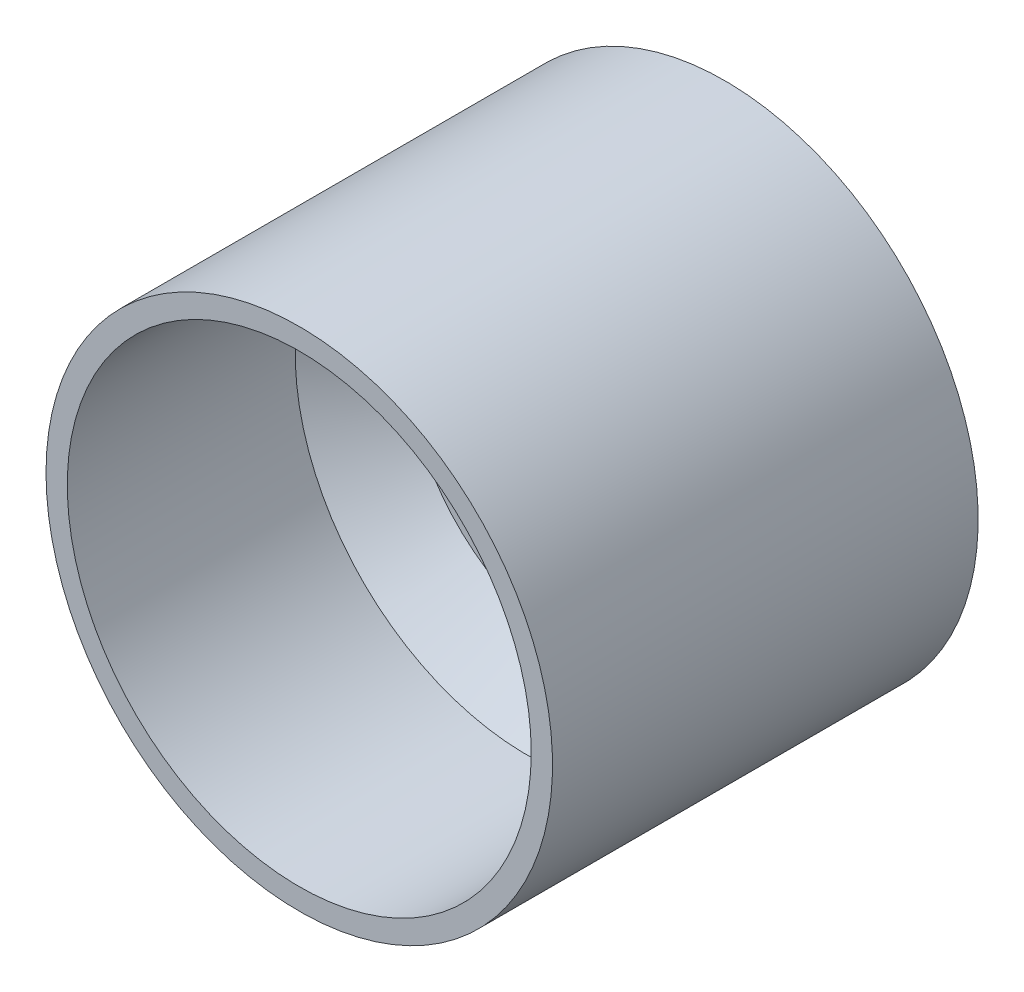
ISO-10303-21;
HEADER;
FILE_DESCRIPTION(('STEP AP214'),'2;1');
FILE_NAME('part.step','',(''),(''),'','','');
FILE_SCHEMA(('AUTOMOTIVE_DESIGN { 1 0 10303 214 1 1 1 1 }'));
ENDSEC;
DATA;
#1=APPLICATION_CONTEXT('core data for automotive mechanical design processes');
#2=APPLICATION_PROTOCOL_DEFINITION('international standard','automotive_design',2000,#1);
#3=PRODUCT_CONTEXT('',#1,'mechanical');
#4=PRODUCT('Part','Part','',(#3));
#5=PRODUCT_RELATED_PRODUCT_CATEGORY('part','',(#4));
#6=PRODUCT_DEFINITION_FORMATION('','',#4);
#7=PRODUCT_DEFINITION_CONTEXT('part definition',#1,'design');
#8=PRODUCT_DEFINITION('design','',#6,#7);
#9=PRODUCT_DEFINITION_SHAPE('','',#8);
#10=(LENGTH_UNIT() NAMED_UNIT(*) SI_UNIT(.MILLI.,.METRE.));
#11=(NAMED_UNIT(*) PLANE_ANGLE_UNIT() SI_UNIT($,.RADIAN.));
#12=(NAMED_UNIT(*) SI_UNIT($,.STERADIAN.) SOLID_ANGLE_UNIT());
#13=UNCERTAINTY_MEASURE_WITH_UNIT(LENGTH_MEASURE(1.E-05),#10,'distance_accuracy_value','');
#14=(GEOMETRIC_REPRESENTATION_CONTEXT(3) GLOBAL_UNCERTAINTY_ASSIGNED_CONTEXT((#13)) GLOBAL_UNIT_ASSIGNED_CONTEXT((#10,
#11,#12)) REPRESENTATION_CONTEXT('',''));
#15=CARTESIAN_POINT('',(0.,0.,0.));
#16=DIRECTION('',(0.,0.,1.));
#17=DIRECTION('',(1.,0.,0.));
#18=AXIS2_PLACEMENT_3D('',#15,#16,#17);
#19=CARTESIAN_POINT('',(0.,0.,38.1));
#20=DIRECTION('',(0.,0.,-1.));
#21=DIRECTION('',(-1.,0.,0.));
#22=AXIS2_PLACEMENT_3D('',#19,#20,#21);
#23=CYLINDRICAL_SURFACE('',#22,45.339);
#24=CARTESIAN_POINT('',(0.,0.,38.1));
#25=DIRECTION('',(0.,0.,1.));
#26=DIRECTION('',(1.,0.,0.));
#27=AXIS2_PLACEMENT_3D('',#24,#25,#26);
#28=CIRCLE('',#27,45.339);
#29=CARTESIAN_POINT('',(-45.339,0.,38.1));
#30=VERTEX_POINT('',#29);
#31=EDGE_CURVE('E60',#30,#30,#28,.T.);
#32=CARTESIAN_POINT('',(0.,0.,-38.1));
#33=DIRECTION('',(0.,0.,1.));
#34=DIRECTION('',(1.,0.,0.));
#35=AXIS2_PLACEMENT_3D('',#32,#33,#34);
#36=CIRCLE('',#35,45.339);
#37=CARTESIAN_POINT('',(-45.339,0.,-38.1));
#38=VERTEX_POINT('',#37);
#39=EDGE_CURVE('E61',#38,#38,#36,.T.);
#40=CARTESIAN_POINT('',(-45.339,0.,38.1));
#41=CARTESIAN_POINT('',(-45.339,0.,37.30625));
#42=CARTESIAN_POINT('',(-45.339,0.,36.5125));
#43=CARTESIAN_POINT('',(-45.339,0.,34.925));
#44=CARTESIAN_POINT('',(-45.339,0.,34.13125));
#45=CARTESIAN_POINT('',(-45.339,0.,32.54375));
#46=CARTESIAN_POINT('',(-45.339,0.,31.75));
#47=CARTESIAN_POINT('',(-45.339,0.,30.1625));
#48=CARTESIAN_POINT('',(-45.339,0.,29.36875));
#49=CARTESIAN_POINT('',(-45.339,0.,27.78125));
#50=CARTESIAN_POINT('',(-45.339,0.,26.9875));
#51=CARTESIAN_POINT('',(-45.339,0.,25.4));
#52=CARTESIAN_POINT('',(-45.339,0.,24.60625));
#53=CARTESIAN_POINT('',(-45.339,0.,23.01875));
#54=CARTESIAN_POINT('',(-45.339,0.,22.225));
#55=CARTESIAN_POINT('',(-45.339,0.,20.6375));
#56=CARTESIAN_POINT('',(-45.339,0.,19.84375));
#57=CARTESIAN_POINT('',(-45.339,0.,18.25625));
#58=CARTESIAN_POINT('',(-45.339,0.,17.4625));
#59=CARTESIAN_POINT('',(-45.339,0.,15.875));
#60=CARTESIAN_POINT('',(-45.339,0.,15.08125));
#61=CARTESIAN_POINT('',(-45.339,0.,13.49375));
#62=CARTESIAN_POINT('',(-45.339,0.,12.7));
#63=CARTESIAN_POINT('',(-45.339,0.,11.1125));
#64=CARTESIAN_POINT('',(-45.339,0.,10.31875));
#65=CARTESIAN_POINT('',(-45.339,0.,8.73124999999999));
#66=CARTESIAN_POINT('',(-45.339,0.,7.93749999999999));
#67=CARTESIAN_POINT('',(-45.339,0.,6.35));
#68=CARTESIAN_POINT('',(-45.339,0.,5.55625));
#69=CARTESIAN_POINT('',(-45.339,0.,3.96875));
#70=CARTESIAN_POINT('',(-45.339,0.,3.175));
#71=CARTESIAN_POINT('',(-45.339,0.,1.5875));
#72=CARTESIAN_POINT('',(-45.339,0.,0.793750000000001));
#73=CARTESIAN_POINT('',(-45.339,0.,-0.793750000000001));
#74=CARTESIAN_POINT('',(-45.339,0.,-1.5875));
#75=CARTESIAN_POINT('',(-45.339,0.,-3.175));
#76=CARTESIAN_POINT('',(-45.339,0.,-3.96875));
#77=CARTESIAN_POINT('',(-45.339,0.,-5.55625));
#78=CARTESIAN_POINT('',(-45.339,0.,-6.35));
#79=CARTESIAN_POINT('',(-45.339,0.,-7.93750000000001));
#80=CARTESIAN_POINT('',(-45.339,0.,-8.73125));
#81=CARTESIAN_POINT('',(-45.339,0.,-10.31875));
#82=CARTESIAN_POINT('',(-45.339,0.,-11.1125));
#83=CARTESIAN_POINT('',(-45.339,0.,-12.7));
#84=CARTESIAN_POINT('',(-45.339,0.,-13.49375));
#85=CARTESIAN_POINT('',(-45.339,0.,-15.08125));
#86=CARTESIAN_POINT('',(-45.339,0.,-15.875));
#87=CARTESIAN_POINT('',(-45.339,0.,-17.4625));
#88=CARTESIAN_POINT('',(-45.339,0.,-18.25625));
#89=CARTESIAN_POINT('',(-45.339,0.,-19.84375));
#90=CARTESIAN_POINT('',(-45.339,0.,-20.6375));
#91=CARTESIAN_POINT('',(-45.339,0.,-22.225));
#92=CARTESIAN_POINT('',(-45.339,0.,-23.01875));
#93=CARTESIAN_POINT('',(-45.339,0.,-24.60625));
#94=CARTESIAN_POINT('',(-45.339,0.,-25.4));
#95=CARTESIAN_POINT('',(-45.339,0.,-26.9875));
#96=CARTESIAN_POINT('',(-45.339,0.,-27.78125));
#97=CARTESIAN_POINT('',(-45.339,0.,-29.36875));
#98=CARTESIAN_POINT('',(-45.339,0.,-30.1625));
#99=CARTESIAN_POINT('',(-45.339,0.,-31.75));
#100=CARTESIAN_POINT('',(-45.339,0.,-32.54375));
#101=CARTESIAN_POINT('',(-45.339,0.,-34.13125));
#102=CARTESIAN_POINT('',(-45.339,0.,-34.925));
#103=CARTESIAN_POINT('',(-45.339,0.,-36.5125));
#104=CARTESIAN_POINT('',(-45.339,0.,-37.30625));
#105=CARTESIAN_POINT('',(-45.339,0.,-38.1));
#106=B_SPLINE_CURVE_WITH_KNOTS('',3,(#40,#41,#42,#43,#44,#45,#46,#47,#48,#49,#50,#51,#52,#53,
#54,#55,#56,#57,#58,#59,#60,#61,#62,#63,#64,#65,#66,#67,#68,#69,#70,#71,#72,#73,#74,#75,#76,#77,
#78,#79,#80,#81,#82,#83,#84,#85,#86,#87,#88,#89,#90,#91,#92,#93,#94,#95,#96,#97,#98,#99,#100,
#101,#102,#103,#104,#105),.UNSPECIFIED.,.F.,.F.,(4,2,2,2,2,2,2,2,2,2,2,2,2,2,2,2,2,2,2,2,2,2,2,
2,2,2,2,2,2,2,2,2,4),(0.,2.38125,4.7625,7.14375,9.52500000000001,11.90625,14.2875,16.66875,
19.05,21.43125,23.8125,26.19375,28.575,30.95625,33.3375,35.71875,38.1,40.48125,42.8625,45.24375,
47.625,50.00625,52.3875,54.76875,57.15,59.53125,61.9125,64.29375,66.675,69.05625,71.4375,
73.81875,76.2),.UNSPECIFIED.);
#107=EDGE_CURVE('BSEAM39',#30,#38,#106,.T.);
#108=ORIENTED_EDGE('',*,*,#31,.F.);
#109=ORIENTED_EDGE('',*,*,#39,.T.);
#110=ORIENTED_EDGE('',*,*,#107,.T.);
#111=ORIENTED_EDGE('',*,*,#107,.F.);
#112=EDGE_LOOP('',(#108,#110,#109,#111));
#113=FACE_BOUND('',#112,.T.);
#114=ADVANCED_FACE('F39',(#113),#23,.T.);
#115=CARTESIAN_POINT('',(0.,0.,38.1));
#116=DIRECTION('',(0.,0.,1.));
#117=DIRECTION('',(1.,0.,0.));
#118=AXIS2_PLACEMENT_3D('',#115,#116,#117);
#119=PLANE('',#118);
#120=CARTESIAN_POINT('',(0.,0.,38.1));
#121=DIRECTION('',(0.,0.,1.));
#122=DIRECTION('',(1.,0.,0.));
#123=AXIS2_PLACEMENT_3D('',#120,#121,#122);
#124=CIRCLE('',#123,41.529);
#125=CARTESIAN_POINT('',(41.529,0.,38.1));
#126=VERTEX_POINT('',#125);
#127=EDGE_CURVE('E64',#126,#126,#124,.T.);
#128=ORIENTED_EDGE('',*,*,#127,.F.);
#129=EDGE_LOOP('',(#128));
#130=FACE_BOUND('',#129,.T.);
#131=ORIENTED_EDGE('',*,*,#31,.T.);
#132=EDGE_LOOP('',(#131));
#133=FACE_BOUND('',#132,.T.);
#134=ADVANCED_FACE('F79',(#130,#133),#119,.T.);
#135=CARTESIAN_POINT('',(0.,0.,-38.1));
#136=DIRECTION('',(0.,0.,1.));
#137=DIRECTION('',(1.,0.,0.));
#138=AXIS2_PLACEMENT_3D('',#135,#136,#137);
#139=PLANE('',#138);
#140=CARTESIAN_POINT('',(0.,0.,-38.1));
#141=DIRECTION('',(0.,0.,-1.));
#142=DIRECTION('',(-1.,0.,0.));
#143=AXIS2_PLACEMENT_3D('',#140,#141,#142);
#144=CIRCLE('',#143,20.0025);
#145=CARTESIAN_POINT('',(-20.0025,0.,-38.1));
#146=VERTEX_POINT('',#145);
#147=EDGE_CURVE('E69',#146,#146,#144,.T.);
#148=ORIENTED_EDGE('',*,*,#147,.F.);
#149=EDGE_LOOP('',(#148));
#150=FACE_BOUND('',#149,.T.);
#151=ORIENTED_EDGE('',*,*,#39,.F.);
#152=EDGE_LOOP('',(#151));
#153=FACE_BOUND('',#152,.T.);
#154=ADVANCED_FACE('F75',(#150,#153),#139,.F.);
#155=CARTESIAN_POINT('',(0.,0.,-12.7));
#156=DIRECTION('',(0.,0.,1.));
#157=DIRECTION('',(1.,0.,0.));
#158=AXIS2_PLACEMENT_3D('',#155,#156,#157);
#159=CYLINDRICAL_SURFACE('',#158,41.529);
#160=CARTESIAN_POINT('',(0.,0.,-2.70000000000004));
#161=DIRECTION('',(0.,0.,1.));
#162=DIRECTION('',(1.,0.,0.));
#163=AXIS2_PLACEMENT_3D('',#160,#161,#162);
#164=CIRCLE('',#163,41.529);
#165=CARTESIAN_POINT('',(41.529,0.,-2.70000000000004));
#166=VERTEX_POINT('',#165);
#167=EDGE_CURVE('E47',#166,#166,#164,.F.);
#168=ORIENTED_EDGE('',*,*,#167,.T.);
#169=EDGE_LOOP('',(#168));
#170=FACE_BOUND('',#169,.T.);
#171=ORIENTED_EDGE('',*,*,#127,.T.);
#172=EDGE_LOOP('',(#171));
#173=FACE_BOUND('',#172,.T.);
#174=ADVANCED_FACE('F78',(#170,#173),#159,.F.);
#175=CARTESIAN_POINT('',(0.,0.,-12.7));
#176=DIRECTION('',(0.,0.,1.));
#177=DIRECTION('',(1.,0.,0.));
#178=AXIS2_PLACEMENT_3D('',#175,#176,#177);
#179=PLANE('',#178);
#180=CARTESIAN_POINT('',(0.,0.,-12.7));
#181=DIRECTION('',(0.,0.,1.));
#182=DIRECTION('',(1.,0.,0.));
#183=AXIS2_PLACEMENT_3D('',#180,#181,#182);
#184=CIRCLE('',#183,31.5289999999999);
#185=CARTESIAN_POINT('',(31.5289999999999,0.,-12.7));
#186=VERTEX_POINT('',#185);
#187=EDGE_CURVE('E51',#186,#186,#184,.T.);
#188=ORIENTED_EDGE('',*,*,#187,.T.);
#189=EDGE_LOOP('',(#188));
#190=FACE_BOUND('',#189,.T.);
#191=CARTESIAN_POINT('',(0.,0.,-12.7));
#192=DIRECTION('',(0.,0.,1.));
#193=DIRECTION('',(1.,0.,0.));
#194=AXIS2_PLACEMENT_3D('',#191,#192,#193);
#195=CIRCLE('',#194,30.0025);
#196=CARTESIAN_POINT('',(30.0025,0.,-12.7));
#197=VERTEX_POINT('',#196);
#198=EDGE_CURVE('E55',#197,#197,#195,.F.);
#199=ORIENTED_EDGE('',*,*,#198,.T.);
#200=EDGE_LOOP('',(#199));
#201=FACE_BOUND('',#200,.T.);
#202=ADVANCED_FACE('F103',(#190,#201),#179,.T.);
#203=CARTESIAN_POINT('',(0.,0.,-12.7));
#204=DIRECTION('',(0.,0.,-1.));
#205=DIRECTION('',(-1.,0.,0.));
#206=AXIS2_PLACEMENT_3D('',#203,#204,#205);
#207=CYLINDRICAL_SURFACE('',#206,20.0025);
#208=CARTESIAN_POINT('',(0.,0.,-22.7));
#209=DIRECTION('',(0.,0.,1.));
#210=DIRECTION('',(1.,0.,0.));
#211=AXIS2_PLACEMENT_3D('',#208,#209,#210);
#212=CIRCLE('',#211,20.0025);
#213=CARTESIAN_POINT('',(20.0025,0.,-22.7));
#214=VERTEX_POINT('',#213);
#215=EDGE_CURVE('E10',#214,#214,#212,.T.);
#216=ORIENTED_EDGE('',*,*,#215,.T.);
#217=EDGE_LOOP('',(#216));
#218=FACE_BOUND('',#217,.T.);
#219=ORIENTED_EDGE('',*,*,#147,.T.);
#220=EDGE_LOOP('',(#219));
#221=FACE_BOUND('',#220,.T.);
#222=ADVANCED_FACE('F73',(#218,#221),#207,.F.);
#223=CARTESIAN_POINT('',(0.,0.,-12.7));
#224=DIRECTION('',(0.,0.,1.));
#225=DIRECTION('',(1.,0.,0.));
#226=AXIS2_PLACEMENT_3D('',#223,#224,#225);
#227=CONICAL_SURFACE('',#226,31.5289999999999,0.785398163397453);
#228=ORIENTED_EDGE('',*,*,#167,.F.);
#229=EDGE_LOOP('',(#228));
#230=FACE_BOUND('',#229,.T.);
#231=ORIENTED_EDGE('',*,*,#187,.F.);
#232=EDGE_LOOP('',(#231));
#233=FACE_BOUND('',#232,.T.);
#234=ADVANCED_FACE('F93',(#230,#233),#227,.F.);
#235=CARTESIAN_POINT('',(0.,0.,-12.7));
#236=DIRECTION('',(0.,0.,1.));
#237=DIRECTION('',(1.,0.,0.));
#238=AXIS2_PLACEMENT_3D('',#235,#236,#237);
#239=CONICAL_SURFACE('',#238,30.0025,0.785398163397447);
#240=ORIENTED_EDGE('',*,*,#215,.F.);
#241=EDGE_LOOP('',(#240));
#242=FACE_BOUND('',#241,.T.);
#243=ORIENTED_EDGE('',*,*,#198,.F.);
#244=EDGE_LOOP('',(#243));
#245=FACE_BOUND('',#244,.T.);
#246=ADVANCED_FACE('F42',(#242,#245),#239,.F.);
#247=CLOSED_SHELL('',(#114,#134,#154,#174,#202,#222,#234,#246));
#248=MANIFOLD_SOLID_BREP('B2',#247);
#249=ADVANCED_BREP_SHAPE_REPRESENTATION('',(#18,#248),#14);
#250=SHAPE_DEFINITION_REPRESENTATION(#9,#249);
ENDSEC;
END-ISO-10303-21;
